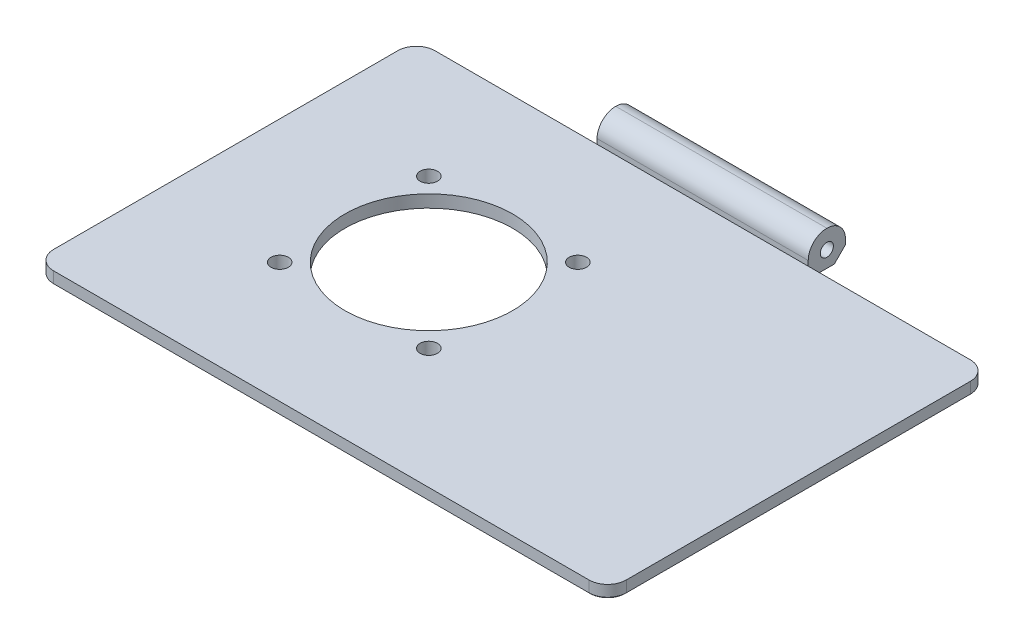
ISO-10303-21;
HEADER;
FILE_DESCRIPTION(('STEP AP214'),'2;1');
FILE_NAME('part.step','',(''),(''),'','','');
FILE_SCHEMA(('AUTOMOTIVE_DESIGN { 1 0 10303 214 1 1 1 1 }'));
ENDSEC;
DATA;
#1=APPLICATION_CONTEXT('core data for automotive mechanical design processes');
#2=APPLICATION_PROTOCOL_DEFINITION('international standard','automotive_design',2000,#1);
#3=PRODUCT_CONTEXT('',#1,'mechanical');
#4=PRODUCT('Part','Part','',(#3));
#5=PRODUCT_RELATED_PRODUCT_CATEGORY('part','',(#4));
#6=PRODUCT_DEFINITION_FORMATION('','',#4);
#7=PRODUCT_DEFINITION_CONTEXT('part definition',#1,'design');
#8=PRODUCT_DEFINITION('design','',#6,#7);
#9=PRODUCT_DEFINITION_SHAPE('','',#8);
#10=(LENGTH_UNIT() NAMED_UNIT(*) SI_UNIT(.MILLI.,.METRE.));
#11=(NAMED_UNIT(*) PLANE_ANGLE_UNIT() SI_UNIT($,.RADIAN.));
#12=(NAMED_UNIT(*) SI_UNIT($,.STERADIAN.) SOLID_ANGLE_UNIT());
#13=UNCERTAINTY_MEASURE_WITH_UNIT(LENGTH_MEASURE(1.E-05),#10,'distance_accuracy_value','');
#14=(GEOMETRIC_REPRESENTATION_CONTEXT(3) GLOBAL_UNCERTAINTY_ASSIGNED_CONTEXT((#13)) GLOBAL_UNIT_ASSIGNED_CONTEXT((#10,
#11,#12)) REPRESENTATION_CONTEXT('',''));
#15=CARTESIAN_POINT('',(0.,0.,0.));
#16=DIRECTION('',(0.,0.,1.));
#17=DIRECTION('',(1.,0.,0.));
#18=AXIS2_PLACEMENT_3D('',#15,#16,#17);
#19=CARTESIAN_POINT('',(3.00000000000002,2.,-61.4));
#20=DIRECTION('',(0.,0.,1.));
#21=DIRECTION('',(1.,0.,0.));
#22=AXIS2_PLACEMENT_3D('',#19,#20,#21);
#23=PLANE('',#22);
#24=DIRECTION('',(0.,-1.,0.));
#25=VECTOR('',#24,1.);
#26=CARTESIAN_POINT('',(29.1,5.8,-61.4));
#27=LINE('',#26,#25);
#28=CARTESIAN_POINT('',(29.1,2.,-61.4));
#29=VERTEX_POINT('',#28);
#30=CARTESIAN_POINT('',(29.1,0.200000000000006,-61.4));
#31=VERTEX_POINT('',#30);
#32=EDGE_CURVE('E358',#29,#31,#27,.T.);
#33=ORIENTED_EDGE('',*,*,#32,.T.);
#34=DIRECTION('',(-1.,0.,0.));
#35=VECTOR('',#34,1.);
#36=CARTESIAN_POINT('',(3.00000000000002,0.200000000000006,-61.4));
#37=LINE('',#36,#35);
#38=CARTESIAN_POINT('',(3.00000000000002,0.200000000000006,-61.4));
#39=VERTEX_POINT('',#38);
#40=EDGE_CURVE('E275',#31,#39,#37,.T.);
#41=ORIENTED_EDGE('',*,*,#40,.T.);
#42=DIRECTION('',(0.,-1.,0.));
#43=VECTOR('',#42,1.);
#44=CARTESIAN_POINT('',(3.00000000000002,2.,-61.4));
#45=LINE('',#44,#43);
#46=CARTESIAN_POINT('',(3.00000000000002,2.,-61.4));
#47=VERTEX_POINT('',#46);
#48=EDGE_CURVE('E210',#47,#39,#45,.T.);
#49=ORIENTED_EDGE('',*,*,#48,.F.);
#50=DIRECTION('',(-1.,0.,0.));
#51=VECTOR('',#50,1.);
#52=CARTESIAN_POINT('',(3.00000000000002,2.,-61.4));
#53=LINE('',#52,#51);
#54=EDGE_CURVE('E197',#29,#47,#53,.T.);
#55=ORIENTED_EDGE('',*,*,#54,.F.);
#56=EDGE_LOOP('',(#33,#41,#49,#55));
#57=FACE_BOUND('',#56,.T.);
#58=ADVANCED_FACE('F37',(#57),#23,.F.);
#59=CARTESIAN_POINT('',(89.2,2.,-58.4));
#60=DIRECTION('',(0.,-1.,0.));
#61=DIRECTION('',(0.,0.,-1.));
#62=AXIS2_PLACEMENT_3D('',#59,#60,#61);
#63=CYLINDRICAL_SURFACE('',#62,3.);
#64=DIRECTION('',(0.,-1.,0.));
#65=VECTOR('',#64,1.);
#66=CARTESIAN_POINT('',(92.2,2.,-58.4));
#67=LINE('',#66,#65);
#68=CARTESIAN_POINT('',(92.2,2.,-58.4));
#69=VERTEX_POINT('',#68);
#70=CARTESIAN_POINT('',(92.2,0.200000000000006,-58.4));
#71=VERTEX_POINT('',#70);
#72=EDGE_CURVE('E377',#69,#71,#67,.T.);
#73=ORIENTED_EDGE('',*,*,#72,.T.);
#74=CARTESIAN_POINT('',(89.2,0.200000000000006,-58.4));
#75=DIRECTION('',(0.,-1.,0.));
#76=DIRECTION('',(0.,0.,-1.));
#77=AXIS2_PLACEMENT_3D('',#74,#75,#76);
#78=CIRCLE('',#77,3.);
#79=CARTESIAN_POINT('',(89.2,0.200000000000006,-61.4));
#80=VERTEX_POINT('',#79);
#81=EDGE_CURVE('E47',#71,#80,#78,.F.);
#82=ORIENTED_EDGE('',*,*,#81,.T.);
#83=DIRECTION('',(0.,-1.,0.));
#84=VECTOR('',#83,1.);
#85=CARTESIAN_POINT('',(89.2,2.,-61.4));
#86=LINE('',#85,#84);
#87=CARTESIAN_POINT('',(89.2,2.,-61.4));
#88=VERTEX_POINT('',#87);
#89=EDGE_CURVE('E189',#88,#80,#86,.T.);
#90=ORIENTED_EDGE('',*,*,#89,.F.);
#91=CARTESIAN_POINT('',(89.2,2.,-58.4));
#92=DIRECTION('',(0.,1.,0.));
#93=DIRECTION('',(0.,0.,-1.));
#94=AXIS2_PLACEMENT_3D('',#91,#92,#93);
#95=CIRCLE('',#94,3.);
#96=EDGE_CURVE('E200',#69,#88,#95,.T.);
#97=ORIENTED_EDGE('',*,*,#96,.F.);
#98=EDGE_LOOP('',(#73,#82,#90,#97));
#99=FACE_BOUND('',#98,.T.);
#100=ADVANCED_FACE('F207',(#99),#63,.T.);
#101=ORIENTED_EDGE('',*,*,#89,.T.);
#102=DIRECTION('',(-1.,0.,0.));
#103=VECTOR('',#102,1.);
#104=CARTESIAN_POINT('',(63.1,0.200000000000006,-61.4));
#105=LINE('',#104,#103);
#106=CARTESIAN_POINT('',(63.1,0.200000000000006,-61.4));
#107=VERTEX_POINT('',#106);
#108=EDGE_CURVE('E285',#80,#107,#105,.T.);
#109=ORIENTED_EDGE('',*,*,#108,.T.);
#110=DIRECTION('',(0.,-1.,0.));
#111=VECTOR('',#110,1.);
#112=CARTESIAN_POINT('',(63.1,5.8,-61.4));
#113=LINE('',#112,#111);
#114=CARTESIAN_POINT('',(63.1,2.,-61.4));
#115=VERTEX_POINT('',#114);
#116=EDGE_CURVE('E192',#115,#107,#113,.T.);
#117=ORIENTED_EDGE('',*,*,#116,.F.);
#118=EDGE_CURVE('E185',#88,#115,#53,.T.);
#119=ORIENTED_EDGE('',*,*,#118,.F.);
#120=EDGE_LOOP('',(#101,#109,#117,#119));
#121=FACE_BOUND('',#120,.T.);
#122=ADVANCED_FACE('F187',(#121),#23,.F.);
#123=CARTESIAN_POINT('',(3.,2.,-58.4));
#124=DIRECTION('',(0.,-1.,0.));
#125=DIRECTION('',(0.,0.,-1.));
#126=AXIS2_PLACEMENT_3D('',#123,#124,#125);
#127=CYLINDRICAL_SURFACE('',#126,3.);
#128=ORIENTED_EDGE('',*,*,#48,.T.);
#129=CARTESIAN_POINT('',(3.,0.200000000000006,-58.4));
#130=DIRECTION('',(0.,-1.,0.));
#131=DIRECTION('',(0.,0.,-1.));
#132=AXIS2_PLACEMENT_3D('',#129,#130,#131);
#133=CIRCLE('',#132,3.);
#134=CARTESIAN_POINT('',(0.,0.200000000000006,-58.4));
#135=VERTEX_POINT('',#134);
#136=EDGE_CURVE('E277',#39,#135,#133,.F.);
#137=ORIENTED_EDGE('',*,*,#136,.T.);
#138=DIRECTION('',(0.,-1.,0.));
#139=VECTOR('',#138,1.);
#140=CARTESIAN_POINT('',(0.,2.,-58.4));
#141=LINE('',#140,#139);
#142=CARTESIAN_POINT('',(0.,2.,-58.4));
#143=VERTEX_POINT('',#142);
#144=EDGE_CURVE('E216',#143,#135,#141,.T.);
#145=ORIENTED_EDGE('',*,*,#144,.F.);
#146=CARTESIAN_POINT('',(3.,2.,-58.4));
#147=DIRECTION('',(0.,1.,0.));
#148=DIRECTION('',(0.,0.,-1.));
#149=AXIS2_PLACEMENT_3D('',#146,#147,#148);
#150=CIRCLE('',#149,3.);
#151=EDGE_CURVE('E196',#47,#143,#150,.T.);
#152=ORIENTED_EDGE('',*,*,#151,.F.);
#153=EDGE_LOOP('',(#128,#137,#145,#152));
#154=FACE_BOUND('',#153,.T.);
#155=ADVANCED_FACE('F501',(#154),#127,.T.);
#156=CARTESIAN_POINT('',(0.,2.,-3.00000000000002));
#157=DIRECTION('',(1.,0.,0.));
#158=DIRECTION('',(0.,0.,-1.));
#159=AXIS2_PLACEMENT_3D('',#156,#157,#158);
#160=PLANE('',#159);
#161=ORIENTED_EDGE('',*,*,#144,.T.);
#162=DIRECTION('',(0.,0.,1.));
#163=VECTOR('',#162,1.);
#164=CARTESIAN_POINT('',(0.,0.200000000000006,-3.00000000000002));
#165=LINE('',#164,#163);
#166=CARTESIAN_POINT('',(0.,0.200000000000006,-3.00000000000002));
#167=VERTEX_POINT('',#166);
#168=EDGE_CURVE('E279',#135,#167,#165,.T.);
#169=ORIENTED_EDGE('',*,*,#168,.T.);
#170=DIRECTION('',(0.,-1.,0.));
#171=VECTOR('',#170,1.);
#172=CARTESIAN_POINT('',(0.,2.,-3.00000000000002));
#173=LINE('',#172,#171);
#174=CARTESIAN_POINT('',(0.,2.,-3.00000000000002));
#175=VERTEX_POINT('',#174);
#176=EDGE_CURVE('E386',#175,#167,#173,.T.);
#177=ORIENTED_EDGE('',*,*,#176,.F.);
#178=DIRECTION('',(0.,0.,1.));
#179=VECTOR('',#178,1.);
#180=CARTESIAN_POINT('',(0.,2.,-3.00000000000002));
#181=LINE('',#180,#179);
#182=EDGE_CURVE('E368',#143,#175,#181,.T.);
#183=ORIENTED_EDGE('',*,*,#182,.F.);
#184=EDGE_LOOP('',(#161,#169,#177,#183));
#185=FACE_BOUND('',#184,.T.);
#186=ADVANCED_FACE('F393',(#185),#160,.F.);
#187=CARTESIAN_POINT('',(3.,2.,-3.));
#188=DIRECTION('',(0.,-1.,0.));
#189=DIRECTION('',(0.,0.,-1.));
#190=AXIS2_PLACEMENT_3D('',#187,#188,#189);
#191=CYLINDRICAL_SURFACE('',#190,3.);
#192=ORIENTED_EDGE('',*,*,#176,.T.);
#193=CARTESIAN_POINT('',(3.,0.200000000000006,-3.));
#194=DIRECTION('',(0.,-1.,0.));
#195=DIRECTION('',(0.,0.,-1.));
#196=AXIS2_PLACEMENT_3D('',#193,#194,#195);
#197=CIRCLE('',#196,3.);
#198=CARTESIAN_POINT('',(3.00000000000002,0.200000000000006,0.));
#199=VERTEX_POINT('',#198);
#200=EDGE_CURVE('E281',#167,#199,#197,.F.);
#201=ORIENTED_EDGE('',*,*,#200,.T.);
#202=DIRECTION('',(0.,-1.,0.));
#203=VECTOR('',#202,1.);
#204=CARTESIAN_POINT('',(3.00000000000002,2.,0.));
#205=LINE('',#204,#203);
#206=CARTESIAN_POINT('',(3.00000000000002,2.,0.));
#207=VERTEX_POINT('',#206);
#208=EDGE_CURVE('E383',#207,#199,#205,.T.);
#209=ORIENTED_EDGE('',*,*,#208,.F.);
#210=CARTESIAN_POINT('',(3.,2.,-3.));
#211=DIRECTION('',(0.,1.,0.));
#212=DIRECTION('',(0.,0.,-1.));
#213=AXIS2_PLACEMENT_3D('',#210,#211,#212);
#214=CIRCLE('',#213,3.);
#215=EDGE_CURVE('E370',#175,#207,#214,.T.);
#216=ORIENTED_EDGE('',*,*,#215,.F.);
#217=EDGE_LOOP('',(#192,#201,#209,#216));
#218=FACE_BOUND('',#217,.T.);
#219=ADVANCED_FACE('F419',(#218),#191,.T.);
#220=CARTESIAN_POINT('',(3.00000000000002,2.,0.));
#221=DIRECTION('',(0.,0.,-1.));
#222=DIRECTION('',(-1.,0.,0.));
#223=AXIS2_PLACEMENT_3D('',#220,#221,#222);
#224=PLANE('',#223);
#225=ORIENTED_EDGE('',*,*,#208,.T.);
#226=DIRECTION('',(1.,0.,0.));
#227=VECTOR('',#226,1.);
#228=CARTESIAN_POINT('',(89.2,0.200000000000006,0.));
#229=LINE('',#228,#227);
#230=CARTESIAN_POINT('',(89.2,0.200000000000006,0.));
#231=VERTEX_POINT('',#230);
#232=EDGE_CURVE('E283',#199,#231,#229,.T.);
#233=ORIENTED_EDGE('',*,*,#232,.T.);
#234=DIRECTION('',(0.,-1.,0.));
#235=VECTOR('',#234,1.);
#236=CARTESIAN_POINT('',(89.2,2.,0.));
#237=LINE('',#236,#235);
#238=CARTESIAN_POINT('',(89.2,2.,0.));
#239=VERTEX_POINT('',#238);
#240=EDGE_CURVE('E381',#239,#231,#237,.T.);
#241=ORIENTED_EDGE('',*,*,#240,.F.);
#242=DIRECTION('',(1.,0.,0.));
#243=VECTOR('',#242,1.);
#244=CARTESIAN_POINT('',(3.00000000000002,2.,0.));
#245=LINE('',#244,#243);
#246=EDGE_CURVE('E372',#207,#239,#245,.T.);
#247=ORIENTED_EDGE('',*,*,#246,.F.);
#248=EDGE_LOOP('',(#225,#233,#241,#247));
#249=FACE_BOUND('',#248,.T.);
#250=ADVANCED_FACE('F424',(#249),#224,.F.);
#251=CARTESIAN_POINT('',(89.2,2.,-3.));
#252=DIRECTION('',(0.,-1.,0.));
#253=DIRECTION('',(0.,0.,-1.));
#254=AXIS2_PLACEMENT_3D('',#251,#252,#253);
#255=CYLINDRICAL_SURFACE('',#254,3.);
#256=ORIENTED_EDGE('',*,*,#240,.T.);
#257=CARTESIAN_POINT('',(89.2,0.200000000000006,-3.));
#258=DIRECTION('',(0.,-1.,0.));
#259=DIRECTION('',(0.,0.,-1.));
#260=AXIS2_PLACEMENT_3D('',#257,#258,#259);
#261=CIRCLE('',#260,3.);
#262=CARTESIAN_POINT('',(92.2,0.200000000000006,-3.00000000000002));
#263=VERTEX_POINT('',#262);
#264=EDGE_CURVE('E61',#231,#263,#261,.F.);
#265=ORIENTED_EDGE('',*,*,#264,.T.);
#266=DIRECTION('',(0.,-1.,0.));
#267=VECTOR('',#266,1.);
#268=CARTESIAN_POINT('',(92.2,2.,-3.00000000000002));
#269=LINE('',#268,#267);
#270=CARTESIAN_POINT('',(92.2,2.,-3.00000000000002));
#271=VERTEX_POINT('',#270);
#272=EDGE_CURVE('E379',#271,#263,#269,.T.);
#273=ORIENTED_EDGE('',*,*,#272,.F.);
#274=CARTESIAN_POINT('',(89.2,2.,-3.));
#275=DIRECTION('',(0.,1.,0.));
#276=DIRECTION('',(0.,0.,1.));
#277=AXIS2_PLACEMENT_3D('',#274,#275,#276);
#278=CIRCLE('',#277,3.);
#279=EDGE_CURVE('E374',#239,#271,#278,.T.);
#280=ORIENTED_EDGE('',*,*,#279,.F.);
#281=EDGE_LOOP('',(#256,#265,#273,#280));
#282=FACE_BOUND('',#281,.T.);
#283=ADVANCED_FACE('F514',(#282),#255,.T.);
#284=CARTESIAN_POINT('',(92.2,2.,-3.00000000000002));
#285=DIRECTION('',(-1.,0.,0.));
#286=DIRECTION('',(0.,0.,1.));
#287=AXIS2_PLACEMENT_3D('',#284,#285,#286);
#288=PLANE('',#287);
#289=ORIENTED_EDGE('',*,*,#272,.T.);
#290=DIRECTION('',(0.,0.,-1.));
#291=VECTOR('',#290,1.);
#292=CARTESIAN_POINT('',(92.2,0.200000000000006,-58.4));
#293=LINE('',#292,#291);
#294=EDGE_CURVE('E11',#263,#71,#293,.T.);
#295=ORIENTED_EDGE('',*,*,#294,.T.);
#296=ORIENTED_EDGE('',*,*,#72,.F.);
#297=DIRECTION('',(0.,0.,-1.));
#298=VECTOR('',#297,1.);
#299=CARTESIAN_POINT('',(92.2,2.,-3.00000000000002));
#300=LINE('',#299,#298);
#301=EDGE_CURVE('E203',#271,#69,#300,.T.);
#302=ORIENTED_EDGE('',*,*,#301,.F.);
#303=EDGE_LOOP('',(#289,#295,#296,#302));
#304=FACE_BOUND('',#303,.T.);
#305=ADVANCED_FACE('F517',(#304),#288,.F.);
#306=CARTESIAN_POINT('',(89.2,2.,-58.4));
#307=DIRECTION('',(0.,-1.,0.));
#308=DIRECTION('',(0.,0.,-1.));
#309=AXIS2_PLACEMENT_3D('',#306,#307,#308);
#310=PLANE('',#309);
#311=CARTESIAN_POINT('',(44.,2.,-43.4000000000003));
#312=DIRECTION('',(0.,1.,0.));
#313=DIRECTION('',(0.,0.,1.));
#314=AXIS2_PLACEMENT_3D('',#311,#312,#313);
#315=CIRCLE('',#314,1.4);
#316=CARTESIAN_POINT('',(44.,2.,-42.0000000000003));
#317=VERTEX_POINT('',#316);
#318=EDGE_CURVE('E336',#317,#317,#315,.T.);
#319=ORIENTED_EDGE('',*,*,#318,.F.);
#320=EDGE_LOOP('',(#319));
#321=FACE_BOUND('',#320,.T.);
#322=CARTESIAN_POINT('',(32.,2.,-31.4000000000002));
#323=DIRECTION('',(0.,1.,0.));
#324=DIRECTION('',(0.,0.,1.));
#325=AXIS2_PLACEMENT_3D('',#322,#323,#324);
#326=CIRCLE('',#325,13.5);
#327=CARTESIAN_POINT('',(32.,2.,-17.9000000000002));
#328=VERTEX_POINT('',#327);
#329=EDGE_CURVE('E335',#328,#328,#326,.T.);
#330=ORIENTED_EDGE('',*,*,#329,.F.);
#331=EDGE_LOOP('',(#330));
#332=FACE_BOUND('',#331,.T.);
#333=CARTESIAN_POINT('',(44.0000000000002,2.,-19.4000000000003));
#334=DIRECTION('',(0.,1.,0.));
#335=DIRECTION('',(0.,0.,1.));
#336=AXIS2_PLACEMENT_3D('',#333,#334,#335);
#337=CIRCLE('',#336,1.4);
#338=CARTESIAN_POINT('',(44.0000000000002,2.,-18.0000000000003));
#339=VERTEX_POINT('',#338);
#340=EDGE_CURVE('E328',#339,#339,#337,.T.);
#341=ORIENTED_EDGE('',*,*,#340,.F.);
#342=EDGE_LOOP('',(#341));
#343=FACE_BOUND('',#342,.T.);
#344=CARTESIAN_POINT('',(20.0000000000002,2.,-19.4));
#345=DIRECTION('',(0.,1.,0.));
#346=DIRECTION('',(0.,0.,1.));
#347=AXIS2_PLACEMENT_3D('',#344,#345,#346);
#348=CIRCLE('',#347,1.4);
#349=CARTESIAN_POINT('',(20.0000000000002,2.,-18.));
#350=VERTEX_POINT('',#349);
#351=EDGE_CURVE('E318',#350,#350,#348,.T.);
#352=ORIENTED_EDGE('',*,*,#351,.F.);
#353=EDGE_LOOP('',(#352));
#354=FACE_BOUND('',#353,.T.);
#355=CARTESIAN_POINT('',(20.,2.,-43.4));
#356=DIRECTION('',(0.,1.,0.));
#357=DIRECTION('',(0.,0.,1.));
#358=AXIS2_PLACEMENT_3D('',#355,#356,#357);
#359=CIRCLE('',#358,1.4);
#360=CARTESIAN_POINT('',(20.,2.,-42.));
#361=VERTEX_POINT('',#360);
#362=EDGE_CURVE('E343',#361,#361,#359,.T.);
#363=ORIENTED_EDGE('',*,*,#362,.F.);
#364=EDGE_LOOP('',(#363));
#365=FACE_BOUND('',#364,.T.);
#366=ORIENTED_EDGE('',*,*,#96,.T.);
#367=ORIENTED_EDGE('',*,*,#118,.T.);
#368=DIRECTION('',(-1.,0.,0.));
#369=VECTOR('',#368,1.);
#370=CARTESIAN_POINT('',(89.2,2.,-61.4));
#371=LINE('',#370,#369);
#372=EDGE_CURVE('E205',#115,#29,#371,.T.);
#373=ORIENTED_EDGE('',*,*,#372,.T.);
#374=ORIENTED_EDGE('',*,*,#54,.T.);
#375=ORIENTED_EDGE('',*,*,#151,.T.);
#376=ORIENTED_EDGE('',*,*,#182,.T.);
#377=ORIENTED_EDGE('',*,*,#215,.T.);
#378=ORIENTED_EDGE('',*,*,#246,.T.);
#379=ORIENTED_EDGE('',*,*,#279,.T.);
#380=ORIENTED_EDGE('',*,*,#301,.T.);
#381=EDGE_LOOP('',(#366,#367,#373,#374,#375,#376,#377,#378,#379,#380));
#382=FACE_BOUND('',#381,.T.);
#383=ADVANCED_FACE('F201',(#321,#332,#343,#354,#365,#382),#310,.F.);
#384=CARTESIAN_POINT('',(89.2,0.,-58.4));
#385=DIRECTION('',(0.,-1.,0.));
#386=DIRECTION('',(0.,0.,-1.));
#387=AXIS2_PLACEMENT_3D('',#384,#385,#386);
#388=PLANE('',#387);
#389=CARTESIAN_POINT('',(44.,0.,-43.4000000000003));
#390=DIRECTION('',(0.,1.,0.));
#391=DIRECTION('',(0.,0.,1.));
#392=AXIS2_PLACEMENT_3D('',#389,#390,#391);
#393=CIRCLE('',#392,1.4);
#394=CARTESIAN_POINT('',(44.,0.,-42.0000000000003));
#395=VERTEX_POINT('',#394);
#396=EDGE_CURVE('E332',#395,#395,#393,.T.);
#397=ORIENTED_EDGE('',*,*,#396,.T.);
#398=EDGE_LOOP('',(#397));
#399=FACE_BOUND('',#398,.T.);
#400=CARTESIAN_POINT('',(32.,0.,-31.4000000000002));
#401=DIRECTION('',(0.,1.,0.));
#402=DIRECTION('',(0.,0.,1.));
#403=AXIS2_PLACEMENT_3D('',#400,#401,#402);
#404=CIRCLE('',#403,13.5);
#405=CARTESIAN_POINT('',(32.,0.,-17.9000000000002));
#406=VERTEX_POINT('',#405);
#407=EDGE_CURVE('E340',#406,#406,#404,.T.);
#408=ORIENTED_EDGE('',*,*,#407,.T.);
#409=EDGE_LOOP('',(#408));
#410=FACE_BOUND('',#409,.T.);
#411=CARTESIAN_POINT('',(44.0000000000002,0.,-19.4000000000003));
#412=DIRECTION('',(0.,1.,0.));
#413=DIRECTION('',(0.,0.,1.));
#414=AXIS2_PLACEMENT_3D('',#411,#412,#413);
#415=CIRCLE('',#414,1.4);
#416=CARTESIAN_POINT('',(44.0000000000002,0.,-18.0000000000003));
#417=VERTEX_POINT('',#416);
#418=EDGE_CURVE('E339',#417,#417,#415,.T.);
#419=ORIENTED_EDGE('',*,*,#418,.T.);
#420=EDGE_LOOP('',(#419));
#421=FACE_BOUND('',#420,.T.);
#422=CARTESIAN_POINT('',(20.0000000000002,0.,-19.4));
#423=DIRECTION('',(0.,1.,0.));
#424=DIRECTION('',(0.,0.,1.));
#425=AXIS2_PLACEMENT_3D('',#422,#423,#424);
#426=CIRCLE('',#425,1.4);
#427=CARTESIAN_POINT('',(20.0000000000002,0.,-18.));
#428=VERTEX_POINT('',#427);
#429=EDGE_CURVE('E323',#428,#428,#426,.T.);
#430=ORIENTED_EDGE('',*,*,#429,.T.);
#431=EDGE_LOOP('',(#430));
#432=FACE_BOUND('',#431,.T.);
#433=CARTESIAN_POINT('',(20.,0.,-43.4));
#434=DIRECTION('',(0.,1.,0.));
#435=DIRECTION('',(0.,0.,1.));
#436=AXIS2_PLACEMENT_3D('',#433,#434,#435);
#437=CIRCLE('',#436,1.4);
#438=CARTESIAN_POINT('',(20.,0.,-42.));
#439=VERTEX_POINT('',#438);
#440=EDGE_CURVE('E234',#439,#439,#437,.T.);
#441=ORIENTED_EDGE('',*,*,#440,.T.);
#442=EDGE_LOOP('',(#441));
#443=FACE_BOUND('',#442,.T.);
#444=DIRECTION('',(1.,0.,0.));
#445=VECTOR('',#444,1.);
#446=CARTESIAN_POINT('',(29.1,0.,-61.2));
#447=LINE('',#446,#445);
#448=CARTESIAN_POINT('',(3.00000000000002,0.,-61.2));
#449=VERTEX_POINT('',#448);
#450=CARTESIAN_POINT('',(29.3,0.,-61.2));
#451=VERTEX_POINT('',#450);
#452=EDGE_CURVE('E260',#449,#451,#447,.T.);
#453=ORIENTED_EDGE('',*,*,#452,.T.);
#454=DIRECTION('',(0.,0.,-1.));
#455=VECTOR('',#454,1.);
#456=CARTESIAN_POINT('',(29.3,0.,-58.4));
#457=LINE('',#456,#455);
#458=CARTESIAN_POINT('',(29.3,0.,-65.4));
#459=VERTEX_POINT('',#458);
#460=EDGE_CURVE('E264',#451,#459,#457,.T.);
#461=ORIENTED_EDGE('',*,*,#460,.T.);
#462=DIRECTION('',(1.,0.,0.));
#463=VECTOR('',#462,1.);
#464=CARTESIAN_POINT('',(89.2,0.,-65.4));
#465=LINE('',#464,#463);
#466=CARTESIAN_POINT('',(62.9,0.,-65.4));
#467=VERTEX_POINT('',#466);
#468=EDGE_CURVE('E229',#459,#467,#465,.T.);
#469=ORIENTED_EDGE('',*,*,#468,.T.);
#470=DIRECTION('',(0.,0.,1.));
#471=VECTOR('',#470,1.);
#472=CARTESIAN_POINT('',(62.9,0.,-58.4));
#473=LINE('',#472,#471);
#474=CARTESIAN_POINT('',(62.9,0.,-61.2));
#475=VERTEX_POINT('',#474);
#476=EDGE_CURVE('E262',#467,#475,#473,.T.);
#477=ORIENTED_EDGE('',*,*,#476,.T.);
#478=DIRECTION('',(1.,0.,0.));
#479=VECTOR('',#478,1.);
#480=CARTESIAN_POINT('',(89.2,0.,-61.2));
#481=LINE('',#480,#479);
#482=CARTESIAN_POINT('',(89.2,0.,-61.2));
#483=VERTEX_POINT('',#482);
#484=EDGE_CURVE('E250',#475,#483,#481,.T.);
#485=ORIENTED_EDGE('',*,*,#484,.T.);
#486=CARTESIAN_POINT('',(89.2,0.,-58.4));
#487=DIRECTION('',(0.,-1.,0.));
#488=DIRECTION('',(0.,0.,-1.));
#489=AXIS2_PLACEMENT_3D('',#486,#487,#488);
#490=CIRCLE('',#489,2.8);
#491=CARTESIAN_POINT('',(92.,0.,-58.4));
#492=VERTEX_POINT('',#491);
#493=EDGE_CURVE('E246',#483,#492,#490,.T.);
#494=ORIENTED_EDGE('',*,*,#493,.T.);
#495=DIRECTION('',(0.,0.,1.));
#496=VECTOR('',#495,1.);
#497=CARTESIAN_POINT('',(92.,0.,-3.00000000000002));
#498=LINE('',#497,#496);
#499=CARTESIAN_POINT('',(92.,0.,-3.00000000000002));
#500=VERTEX_POINT('',#499);
#501=EDGE_CURVE('E244',#492,#500,#498,.T.);
#502=ORIENTED_EDGE('',*,*,#501,.T.);
#503=CARTESIAN_POINT('',(89.2,0.,-3.));
#504=DIRECTION('',(0.,-1.,0.));
#505=DIRECTION('',(0.,0.,-1.));
#506=AXIS2_PLACEMENT_3D('',#503,#504,#505);
#507=CIRCLE('',#506,2.8);
#508=CARTESIAN_POINT('',(89.2,0.,-0.200000000000003));
#509=VERTEX_POINT('',#508);
#510=EDGE_CURVE('E248',#500,#509,#507,.T.);
#511=ORIENTED_EDGE('',*,*,#510,.T.);
#512=DIRECTION('',(-1.,0.,0.));
#513=VECTOR('',#512,1.);
#514=CARTESIAN_POINT('',(3.00000000000002,0.,-0.200000000000006));
#515=LINE('',#514,#513);
#516=CARTESIAN_POINT('',(3.00000000000002,0.,-0.200000000000006));
#517=VERTEX_POINT('',#516);
#518=EDGE_CURVE('E252',#509,#517,#515,.T.);
#519=ORIENTED_EDGE('',*,*,#518,.T.);
#520=CARTESIAN_POINT('',(3.,0.,-3.));
#521=DIRECTION('',(0.,-1.,0.));
#522=DIRECTION('',(0.,0.,-1.));
#523=AXIS2_PLACEMENT_3D('',#520,#521,#522);
#524=CIRCLE('',#523,2.79999999999999);
#525=CARTESIAN_POINT('',(0.200000000000006,0.,-3.00000000000002));
#526=VERTEX_POINT('',#525);
#527=EDGE_CURVE('E254',#517,#526,#524,.T.);
#528=ORIENTED_EDGE('',*,*,#527,.T.);
#529=DIRECTION('',(0.,0.,-1.));
#530=VECTOR('',#529,1.);
#531=CARTESIAN_POINT('',(0.200000000000006,0.,-58.4));
#532=LINE('',#531,#530);
#533=CARTESIAN_POINT('',(0.200000000000006,0.,-58.4));
#534=VERTEX_POINT('',#533);
#535=EDGE_CURVE('E256',#526,#534,#532,.T.);
#536=ORIENTED_EDGE('',*,*,#535,.T.);
#537=CARTESIAN_POINT('',(3.,0.,-58.4));
#538=DIRECTION('',(0.,-1.,0.));
#539=DIRECTION('',(0.,0.,-1.));
#540=AXIS2_PLACEMENT_3D('',#537,#538,#539);
#541=CIRCLE('',#540,2.8);
#542=EDGE_CURVE('E258',#534,#449,#541,.T.);
#543=ORIENTED_EDGE('',*,*,#542,.T.);
#544=EDGE_LOOP('',(#453,#461,#469,#477,#485,#494,#502,#511,#519,#528,#536,#543));
#545=FACE_BOUND('',#544,.T.);
#546=ADVANCED_FACE('F409',(#399,#410,#421,#432,#443,#545),#388,.T.);
#547=CARTESIAN_POINT('',(29.1,5.8,-61.4));
#548=DIRECTION('',(0.,0.,1.));
#549=DIRECTION('',(1.,0.,0.));
#550=AXIS2_PLACEMENT_3D('',#547,#548,#549);
#551=PLANE('',#550);
#552=CARTESIAN_POINT('',(63.1,2.8,-61.4));
#553=VERTEX_POINT('',#552);
#554=EDGE_CURVE('E359',#553,#115,#113,.T.);
#555=ORIENTED_EDGE('',*,*,#554,.F.);
#556=DIRECTION('',(-1.,0.,0.));
#557=VECTOR('',#556,1.);
#558=CARTESIAN_POINT('',(29.1,2.8,-61.4));
#559=LINE('',#558,#557);
#560=CARTESIAN_POINT('',(29.1,2.8,-61.4));
#561=VERTEX_POINT('',#560);
#562=EDGE_CURVE('E227',#553,#561,#559,.T.);
#563=ORIENTED_EDGE('',*,*,#562,.T.);
#564=EDGE_CURVE('E356',#561,#29,#27,.T.);
#565=ORIENTED_EDGE('',*,*,#564,.T.);
#566=ORIENTED_EDGE('',*,*,#372,.F.);
#567=EDGE_LOOP('',(#555,#563,#565,#566));
#568=FACE_BOUND('',#567,.T.);
#569=ADVANCED_FACE('F476',(#568),#551,.T.);
#570=CARTESIAN_POINT('',(29.1,5.8,-67.4));
#571=DIRECTION('',(-1.,0.,0.));
#572=DIRECTION('',(0.,0.,1.));
#573=AXIS2_PLACEMENT_3D('',#570,#571,#572);
#574=PLANE('',#573);
#575=CARTESIAN_POINT('',(29.1,2.8,-64.4));
#576=DIRECTION('',(-1.,0.,0.));
#577=DIRECTION('',(0.,0.,1.));
#578=AXIS2_PLACEMENT_3D('',#575,#576,#577);
#579=CIRCLE('',#578,1.04999999999999);
#580=CARTESIAN_POINT('',(29.1,2.8,-63.35));
#581=VERTEX_POINT('',#580);
#582=EDGE_CURVE('E352',#581,#581,#579,.T.);
#583=ORIENTED_EDGE('',*,*,#582,.F.);
#584=EDGE_LOOP('',(#583));
#585=FACE_BOUND('',#584,.T.);
#586=DIRECTION('',(0.,0.707106781186552,-0.707106781186543));
#587=VECTOR('',#586,1.);
#588=CARTESIAN_POINT('',(29.1,3.90000000000004,-69.3));
#589=LINE('',#588,#587);
#590=CARTESIAN_POINT('',(29.1,2.00000000000003,-67.4));
#591=VERTEX_POINT('',#590);
#592=CARTESIAN_POINT('',(29.1,0.200000000000007,-65.6));
#593=VERTEX_POINT('',#592);
#594=EDGE_CURVE('E241',#591,#593,#589,.F.);
#595=ORIENTED_EDGE('',*,*,#594,.T.);
#596=DIRECTION('',(0.,0.,1.));
#597=VECTOR('',#596,1.);
#598=CARTESIAN_POINT('',(29.1,0.200000000000006,-67.4));
#599=LINE('',#598,#597);
#600=EDGE_CURVE('E271',#593,#31,#599,.T.);
#601=ORIENTED_EDGE('',*,*,#600,.T.);
#602=ORIENTED_EDGE('',*,*,#32,.F.);
#603=ORIENTED_EDGE('',*,*,#564,.F.);
#604=CARTESIAN_POINT('',(29.1,2.8,-64.4));
#605=DIRECTION('',(-1.,0.,0.));
#606=DIRECTION('',(0.,0.,1.));
#607=AXIS2_PLACEMENT_3D('',#604,#605,#606);
#608=CIRCLE('',#607,3.);
#609=CARTESIAN_POINT('',(29.1,5.8,-64.4));
#610=VERTEX_POINT('',#609);
#611=EDGE_CURVE('E223',#561,#610,#608,.T.);
#612=ORIENTED_EDGE('',*,*,#611,.T.);
#613=CARTESIAN_POINT('',(29.1,2.8,-64.4));
#614=DIRECTION('',(-1.,0.,0.));
#615=DIRECTION('',(0.,0.,1.));
#616=AXIS2_PLACEMENT_3D('',#613,#614,#615);
#617=CIRCLE('',#616,3.);
#618=CARTESIAN_POINT('',(29.1,2.8,-67.4));
#619=VERTEX_POINT('',#618);
#620=EDGE_CURVE('E225',#610,#619,#617,.T.);
#621=ORIENTED_EDGE('',*,*,#620,.T.);
#622=DIRECTION('',(0.,-1.,0.));
#623=VECTOR('',#622,1.);
#624=CARTESIAN_POINT('',(29.1,5.8,-67.4));
#625=LINE('',#624,#623);
#626=EDGE_CURVE('E355',#619,#591,#625,.T.);
#627=ORIENTED_EDGE('',*,*,#626,.T.);
#628=EDGE_LOOP('',(#595,#601,#602,#603,#612,#621,#627));
#629=FACE_BOUND('',#628,.T.);
#630=ADVANCED_FACE('F457',(#585,#629),#574,.T.);
#631=CARTESIAN_POINT('',(63.1,5.8,-67.4));
#632=DIRECTION('',(1.,0.,0.));
#633=DIRECTION('',(0.,0.,-1.));
#634=AXIS2_PLACEMENT_3D('',#631,#632,#633);
#635=PLANE('',#634);
#636=CARTESIAN_POINT('',(63.1,2.8,-64.4));
#637=DIRECTION('',(1.,0.,0.));
#638=DIRECTION('',(0.,0.,-1.));
#639=AXIS2_PLACEMENT_3D('',#636,#637,#638);
#640=CIRCLE('',#639,1.04999999999999);
#641=CARTESIAN_POINT('',(63.1,2.8,-65.45));
#642=VERTEX_POINT('',#641);
#643=EDGE_CURVE('E233',#642,#642,#640,.T.);
#644=ORIENTED_EDGE('',*,*,#643,.F.);
#645=EDGE_LOOP('',(#644));
#646=FACE_BOUND('',#645,.T.);
#647=ORIENTED_EDGE('',*,*,#116,.T.);
#648=DIRECTION('',(0.,0.,-1.));
#649=VECTOR('',#648,1.);
#650=CARTESIAN_POINT('',(63.1,0.199999999999992,-67.4));
#651=LINE('',#650,#649);
#652=CARTESIAN_POINT('',(63.1,0.199999999999994,-65.6));
#653=VERTEX_POINT('',#652);
#654=EDGE_CURVE('E273',#107,#653,#651,.T.);
#655=ORIENTED_EDGE('',*,*,#654,.T.);
#656=DIRECTION('',(0.,-0.707106781186552,0.707106781186543));
#657=VECTOR('',#656,1.);
#658=CARTESIAN_POINT('',(63.1,3.90000000000004,-69.3));
#659=LINE('',#658,#657);
#660=CARTESIAN_POINT('',(63.1,2.00000000000003,-67.4));
#661=VERTEX_POINT('',#660);
#662=EDGE_CURVE('E237',#653,#661,#659,.F.);
#663=ORIENTED_EDGE('',*,*,#662,.T.);
#664=DIRECTION('',(0.,-1.,0.));
#665=VECTOR('',#664,1.);
#666=CARTESIAN_POINT('',(63.1,5.8,-67.4));
#667=LINE('',#666,#665);
#668=CARTESIAN_POINT('',(63.1,2.8,-67.4));
#669=VERTEX_POINT('',#668);
#670=EDGE_CURVE('E361',#669,#661,#667,.T.);
#671=ORIENTED_EDGE('',*,*,#670,.F.);
#672=CARTESIAN_POINT('',(63.1,2.8,-64.4));
#673=DIRECTION('',(1.,0.,0.));
#674=DIRECTION('',(0.,0.,-1.));
#675=AXIS2_PLACEMENT_3D('',#672,#673,#674);
#676=CIRCLE('',#675,3.);
#677=CARTESIAN_POINT('',(63.1,5.8,-64.4));
#678=VERTEX_POINT('',#677);
#679=EDGE_CURVE('E221',#669,#678,#676,.T.);
#680=ORIENTED_EDGE('',*,*,#679,.T.);
#681=CARTESIAN_POINT('',(63.1,2.8,-64.4));
#682=DIRECTION('',(1.,0.,0.));
#683=DIRECTION('',(0.,0.,-1.));
#684=AXIS2_PLACEMENT_3D('',#681,#682,#683);
#685=CIRCLE('',#684,3.);
#686=EDGE_CURVE('E213',#678,#553,#685,.T.);
#687=ORIENTED_EDGE('',*,*,#686,.T.);
#688=ORIENTED_EDGE('',*,*,#554,.T.);
#689=EDGE_LOOP('',(#647,#655,#663,#671,#680,#687,#688));
#690=FACE_BOUND('',#689,.T.);
#691=ADVANCED_FACE('F442',(#646,#690),#635,.T.);
#692=CARTESIAN_POINT('',(29.1,5.8,-67.4));
#693=DIRECTION('',(0.,0.,-1.));
#694=DIRECTION('',(-1.,0.,0.));
#695=AXIS2_PLACEMENT_3D('',#692,#693,#694);
#696=PLANE('',#695);
#697=ORIENTED_EDGE('',*,*,#670,.T.);
#698=DIRECTION('',(-1.,0.,0.));
#699=VECTOR('',#698,1.);
#700=CARTESIAN_POINT('',(29.1,2.00000000000003,-67.4));
#701=LINE('',#700,#699);
#702=EDGE_CURVE('E239',#661,#591,#701,.T.);
#703=ORIENTED_EDGE('',*,*,#702,.T.);
#704=ORIENTED_EDGE('',*,*,#626,.F.);
#705=DIRECTION('',(1.,0.,0.));
#706=VECTOR('',#705,1.);
#707=CARTESIAN_POINT('',(29.1,2.8,-67.4));
#708=LINE('',#707,#706);
#709=EDGE_CURVE('E209',#619,#669,#708,.T.);
#710=ORIENTED_EDGE('',*,*,#709,.T.);
#711=EDGE_LOOP('',(#697,#703,#704,#710));
#712=FACE_BOUND('',#711,.T.);
#713=ADVANCED_FACE('F464',(#712),#696,.T.);
#714=CARTESIAN_POINT('',(0.,2.8,-64.4));
#715=DIRECTION('',(1.,0.,0.));
#716=DIRECTION('',(0.,0.,-1.));
#717=AXIS2_PLACEMENT_3D('',#714,#715,#716);
#718=CYLINDRICAL_SURFACE('',#717,1.04999999999999);
#719=ORIENTED_EDGE('',*,*,#582,.T.);
#720=EDGE_LOOP('',(#719));
#721=FACE_BOUND('',#720,.T.);
#722=ORIENTED_EDGE('',*,*,#643,.T.);
#723=EDGE_LOOP('',(#722));
#724=FACE_BOUND('',#723,.T.);
#725=ADVANCED_FACE('F531',(#721,#724),#718,.F.);
#726=CARTESIAN_POINT('',(29.1,2.8,-64.4));
#727=DIRECTION('',(-1.,0.,0.));
#728=DIRECTION('',(0.,0.,1.));
#729=AXIS2_PLACEMENT_3D('',#726,#727,#728);
#730=CYLINDRICAL_SURFACE('',#729,3.);
#731=DIRECTION('',(-1.,0.,0.));
#732=VECTOR('',#731,1.);
#733=CARTESIAN_POINT('',(0.,5.8,-64.4));
#734=LINE('',#733,#732);
#735=EDGE_CURVE('E230',#610,#678,#734,.F.);
#736=ORIENTED_EDGE('',*,*,#735,.F.);
#737=ORIENTED_EDGE('',*,*,#611,.F.);
#738=ORIENTED_EDGE('',*,*,#562,.F.);
#739=ORIENTED_EDGE('',*,*,#686,.F.);
#740=EDGE_LOOP('',(#736,#737,#738,#739));
#741=FACE_BOUND('',#740,.T.);
#742=ADVANCED_FACE('F472',(#741),#730,.T.);
#743=CARTESIAN_POINT('',(29.1,2.8,-64.4));
#744=DIRECTION('',(1.,0.,0.));
#745=DIRECTION('',(0.,0.,-1.));
#746=AXIS2_PLACEMENT_3D('',#743,#744,#745);
#747=CYLINDRICAL_SURFACE('',#746,3.);
#748=ORIENTED_EDGE('',*,*,#620,.F.);
#749=ORIENTED_EDGE('',*,*,#735,.T.);
#750=ORIENTED_EDGE('',*,*,#679,.F.);
#751=ORIENTED_EDGE('',*,*,#709,.F.);
#752=EDGE_LOOP('',(#748,#749,#750,#751));
#753=FACE_BOUND('',#752,.T.);
#754=ADVANCED_FACE('F467',(#753),#747,.T.);
#755=CARTESIAN_POINT('',(89.2,0.,-65.4));
#756=DIRECTION('',(0.,0.707106781186542,0.707106781186552));
#757=DIRECTION('',(1.,0.,0.));
#758=AXIS2_PLACEMENT_3D('',#755,#756,#757);
#759=PLANE('',#758);
#760=ORIENTED_EDGE('',*,*,#468,.F.);
#761=DIRECTION('',(-0.577350269189629,0.577350269189629,-0.57735026918962));
#762=VECTOR('',#761,1.);
#763=CARTESIAN_POINT('',(49.2666666666669,-19.9666666666668,-45.4333333333334));
#764=LINE('',#763,#762);
#765=EDGE_CURVE('E269',#459,#593,#764,.T.);
#766=ORIENTED_EDGE('',*,*,#765,.T.);
#767=ORIENTED_EDGE('',*,*,#594,.F.);
#768=ORIENTED_EDGE('',*,*,#702,.F.);
#769=ORIENTED_EDGE('',*,*,#662,.F.);
#770=DIRECTION('',(-0.577350269189629,-0.577350269189629,0.57735026918962));
#771=VECTOR('',#770,1.);
#772=CARTESIAN_POINT('',(71.6666666666668,8.76666666666674,-74.1666666666666));
#773=LINE('',#772,#771);
#774=EDGE_CURVE('E267',#653,#467,#773,.T.);
#775=ORIENTED_EDGE('',*,*,#774,.T.);
#776=EDGE_LOOP('',(#760,#766,#767,#768,#769,#775));
#777=FACE_BOUND('',#776,.T.);
#778=ADVANCED_FACE('F449',(#777),#759,.F.);
#779=CARTESIAN_POINT('',(20.,0.,-43.4));
#780=DIRECTION('',(0.,1.,0.));
#781=DIRECTION('',(0.,0.,1.));
#782=AXIS2_PLACEMENT_3D('',#779,#780,#781);
#783=CYLINDRICAL_SURFACE('',#782,1.4);
#784=ORIENTED_EDGE('',*,*,#440,.F.);
#785=EDGE_LOOP('',(#784));
#786=FACE_BOUND('',#785,.T.);
#787=ORIENTED_EDGE('',*,*,#362,.T.);
#788=EDGE_LOOP('',(#787));
#789=FACE_BOUND('',#788,.T.);
#790=ADVANCED_FACE('F540',(#786,#789),#783,.F.);
#791=CARTESIAN_POINT('',(20.0000000000002,0.,-19.4));
#792=DIRECTION('',(0.,1.,0.));
#793=DIRECTION('',(0.,0.,1.));
#794=AXIS2_PLACEMENT_3D('',#791,#792,#793);
#795=CYLINDRICAL_SURFACE('',#794,1.4);
#796=ORIENTED_EDGE('',*,*,#429,.F.);
#797=EDGE_LOOP('',(#796));
#798=FACE_BOUND('',#797,.T.);
#799=ORIENTED_EDGE('',*,*,#351,.T.);
#800=EDGE_LOOP('',(#799));
#801=FACE_BOUND('',#800,.T.);
#802=ADVANCED_FACE('F543',(#798,#801),#795,.F.);
#803=CARTESIAN_POINT('',(44.0000000000002,0.,-19.4000000000003));
#804=DIRECTION('',(0.,1.,0.));
#805=DIRECTION('',(0.,0.,1.));
#806=AXIS2_PLACEMENT_3D('',#803,#804,#805);
#807=CYLINDRICAL_SURFACE('',#806,1.4);
#808=ORIENTED_EDGE('',*,*,#418,.F.);
#809=EDGE_LOOP('',(#808));
#810=FACE_BOUND('',#809,.T.);
#811=ORIENTED_EDGE('',*,*,#340,.T.);
#812=EDGE_LOOP('',(#811));
#813=FACE_BOUND('',#812,.T.);
#814=ADVANCED_FACE('F549',(#810,#813),#807,.F.);
#815=CARTESIAN_POINT('',(32.,0.,-31.4000000000002));
#816=DIRECTION('',(0.,1.,0.));
#817=DIRECTION('',(0.,0.,1.));
#818=AXIS2_PLACEMENT_3D('',#815,#816,#817);
#819=CYLINDRICAL_SURFACE('',#818,13.5);
#820=ORIENTED_EDGE('',*,*,#407,.F.);
#821=EDGE_LOOP('',(#820));
#822=FACE_BOUND('',#821,.T.);
#823=ORIENTED_EDGE('',*,*,#329,.T.);
#824=EDGE_LOOP('',(#823));
#825=FACE_BOUND('',#824,.T.);
#826=ADVANCED_FACE('F545',(#822,#825),#819,.F.);
#827=CARTESIAN_POINT('',(44.,0.,-43.4000000000003));
#828=DIRECTION('',(0.,1.,0.));
#829=DIRECTION('',(0.,0.,1.));
#830=AXIS2_PLACEMENT_3D('',#827,#828,#829);
#831=CYLINDRICAL_SURFACE('',#830,1.4);
#832=ORIENTED_EDGE('',*,*,#396,.F.);
#833=EDGE_LOOP('',(#832));
#834=FACE_BOUND('',#833,.T.);
#835=ORIENTED_EDGE('',*,*,#318,.T.);
#836=EDGE_LOOP('',(#835));
#837=FACE_BOUND('',#836,.T.);
#838=ADVANCED_FACE('F548',(#834,#837),#831,.F.);
#839=CARTESIAN_POINT('',(62.9,0.,-58.4));
#840=DIRECTION('',(-0.707106781186548,0.707106781186548,0.));
#841=DIRECTION('',(0.,0.,1.));
#842=AXIS2_PLACEMENT_3D('',#839,#840,#841);
#843=PLANE('',#842);
#844=ORIENTED_EDGE('',*,*,#774,.F.);
#845=ORIENTED_EDGE('',*,*,#654,.F.);
#846=DIRECTION('',(-0.577350269189626,-0.577350269189626,0.577350269189626));
#847=VECTOR('',#846,1.);
#848=CARTESIAN_POINT('',(61.9666666666667,-0.933333333333332,-60.2666666666667));
#849=LINE('',#848,#847);
#850=EDGE_CURVE('E42',#475,#107,#849,.F.);
#851=ORIENTED_EDGE('',*,*,#850,.F.);
#852=ORIENTED_EDGE('',*,*,#476,.F.);
#853=EDGE_LOOP('',(#844,#845,#851,#852));
#854=FACE_BOUND('',#853,.T.);
#855=ADVANCED_FACE('F40',(#854),#843,.F.);
#856=CARTESIAN_POINT('',(3.00000000000002,0.200000000000006,-61.4));
#857=DIRECTION('',(0.,-0.707106781186548,-0.707106781186548));
#858=DIRECTION('',(1.,0.,0.));
#859=AXIS2_PLACEMENT_3D('',#856,#857,#858);
#860=PLANE('',#859);
#861=ORIENTED_EDGE('',*,*,#850,.T.);
#862=ORIENTED_EDGE('',*,*,#108,.F.);
#863=DIRECTION('',(0.,0.707106781186548,-0.707106781186548));
#864=VECTOR('',#863,1.);
#865=CARTESIAN_POINT('',(89.2,0.,-61.2));
#866=LINE('',#865,#864);
#867=EDGE_CURVE('E312',#483,#80,#866,.T.);
#868=ORIENTED_EDGE('',*,*,#867,.F.);
#869=ORIENTED_EDGE('',*,*,#484,.F.);
#870=EDGE_LOOP('',(#861,#862,#868,#869));
#871=FACE_BOUND('',#870,.T.);
#872=ADVANCED_FACE('F439',(#871),#860,.T.);
#873=CARTESIAN_POINT('',(89.2,0.200000000000006,-58.4));
#874=DIRECTION('',(0.,1.,0.));
#875=DIRECTION('',(0.,0.,1.));
#876=AXIS2_PLACEMENT_3D('',#873,#874,#875);
#877=CONICAL_SURFACE('',#876,3.,0.785398163397448);
#878=ORIENTED_EDGE('',*,*,#867,.T.);
#879=ORIENTED_EDGE('',*,*,#81,.F.);
#880=DIRECTION('',(0.707106781186548,0.707106781186548,0.));
#881=VECTOR('',#880,1.);
#882=CARTESIAN_POINT('',(92.,0.,-58.4));
#883=LINE('',#882,#881);
#884=EDGE_CURVE('E310',#492,#71,#883,.T.);
#885=ORIENTED_EDGE('',*,*,#884,.F.);
#886=ORIENTED_EDGE('',*,*,#493,.F.);
#887=EDGE_LOOP('',(#878,#879,#885,#886));
#888=FACE_BOUND('',#887,.T.);
#889=ADVANCED_FACE('F437',(#888),#877,.T.);
#890=CARTESIAN_POINT('',(92.2,0.200000000000006,-3.00000000000002));
#891=DIRECTION('',(0.707106781186548,-0.707106781186548,0.));
#892=DIRECTION('',(0.,0.,1.));
#893=AXIS2_PLACEMENT_3D('',#890,#891,#892);
#894=PLANE('',#893);
#895=ORIENTED_EDGE('',*,*,#884,.T.);
#896=ORIENTED_EDGE('',*,*,#294,.F.);
#897=DIRECTION('',(0.707106781186548,0.707106781186548,0.));
#898=VECTOR('',#897,1.);
#899=CARTESIAN_POINT('',(92.,0.,-3.00000000000002));
#900=LINE('',#899,#898);
#901=EDGE_CURVE('E307',#500,#263,#900,.T.);
#902=ORIENTED_EDGE('',*,*,#901,.F.);
#903=ORIENTED_EDGE('',*,*,#501,.F.);
#904=EDGE_LOOP('',(#895,#896,#902,#903));
#905=FACE_BOUND('',#904,.T.);
#906=ADVANCED_FACE('F435',(#905),#894,.T.);
#907=CARTESIAN_POINT('',(89.2,0.200000000000006,-3.));
#908=DIRECTION('',(0.,1.,0.));
#909=DIRECTION('',(0.,0.,1.));
#910=AXIS2_PLACEMENT_3D('',#907,#908,#909);
#911=CONICAL_SURFACE('',#910,3.,0.785398163397444);
#912=ORIENTED_EDGE('',*,*,#901,.T.);
#913=ORIENTED_EDGE('',*,*,#264,.F.);
#914=DIRECTION('',(0.,0.707106781186551,0.707106781186545));
#915=VECTOR('',#914,1.);
#916=CARTESIAN_POINT('',(89.2,0.,-0.200000000000003));
#917=LINE('',#916,#915);
#918=EDGE_CURVE('E304',#509,#231,#917,.T.);
#919=ORIENTED_EDGE('',*,*,#918,.F.);
#920=ORIENTED_EDGE('',*,*,#510,.F.);
#921=EDGE_LOOP('',(#912,#913,#919,#920));
#922=FACE_BOUND('',#921,.T.);
#923=ADVANCED_FACE('F431',(#922),#911,.T.);
#924=CARTESIAN_POINT('',(3.00000000000002,0.200000000000006,0.));
#925=DIRECTION('',(0.,-0.707106781186548,0.707106781186548));
#926=DIRECTION('',(-1.,0.,0.));
#927=AXIS2_PLACEMENT_3D('',#924,#925,#926);
#928=PLANE('',#927);
#929=ORIENTED_EDGE('',*,*,#918,.T.);
#930=ORIENTED_EDGE('',*,*,#232,.F.);
#931=DIRECTION('',(0.,0.707106781186547,0.707106781186548));
#932=VECTOR('',#931,1.);
#933=CARTESIAN_POINT('',(3.00000000000002,0.,-0.200000000000006));
#934=LINE('',#933,#932);
#935=EDGE_CURVE('E301',#517,#199,#934,.T.);
#936=ORIENTED_EDGE('',*,*,#935,.F.);
#937=ORIENTED_EDGE('',*,*,#518,.F.);
#938=EDGE_LOOP('',(#929,#930,#936,#937));
#939=FACE_BOUND('',#938,.T.);
#940=ADVANCED_FACE('F427',(#939),#928,.T.);
#941=CARTESIAN_POINT('',(3.,0.200000000000006,-3.));
#942=DIRECTION('',(0.,1.,0.));
#943=DIRECTION('',(0.,0.,1.));
#944=AXIS2_PLACEMENT_3D('',#941,#942,#943);
#945=CONICAL_SURFACE('',#944,3.,0.785398163397448);
#946=ORIENTED_EDGE('',*,*,#935,.T.);
#947=ORIENTED_EDGE('',*,*,#200,.F.);
#948=DIRECTION('',(-0.707106781186548,0.707106781186547,0.));
#949=VECTOR('',#948,1.);
#950=CARTESIAN_POINT('',(0.200000000000006,0.,-3.00000000000002));
#951=LINE('',#950,#949);
#952=EDGE_CURVE('E298',#526,#167,#951,.T.);
#953=ORIENTED_EDGE('',*,*,#952,.F.);
#954=ORIENTED_EDGE('',*,*,#527,.F.);
#955=EDGE_LOOP('',(#946,#947,#953,#954));
#956=FACE_BOUND('',#955,.T.);
#957=ADVANCED_FACE('F416',(#956),#945,.T.);
#958=CARTESIAN_POINT('',(0.,0.200000000000006,-3.00000000000002));
#959=DIRECTION('',(-0.707106781186548,-0.707106781186548,0.));
#960=DIRECTION('',(0.,0.,-1.));
#961=AXIS2_PLACEMENT_3D('',#958,#959,#960);
#962=PLANE('',#961);
#963=ORIENTED_EDGE('',*,*,#952,.T.);
#964=ORIENTED_EDGE('',*,*,#168,.F.);
#965=DIRECTION('',(-0.707106781186548,0.707106781186547,0.));
#966=VECTOR('',#965,1.);
#967=CARTESIAN_POINT('',(0.200000000000006,0.,-58.4));
#968=LINE('',#967,#966);
#969=EDGE_CURVE('E295',#534,#135,#968,.T.);
#970=ORIENTED_EDGE('',*,*,#969,.F.);
#971=ORIENTED_EDGE('',*,*,#535,.F.);
#972=EDGE_LOOP('',(#963,#964,#970,#971));
#973=FACE_BOUND('',#972,.T.);
#974=ADVANCED_FACE('F399',(#973),#962,.T.);
#975=CARTESIAN_POINT('',(3.,0.200000000000006,-58.4));
#976=DIRECTION('',(0.,1.,0.));
#977=DIRECTION('',(0.,0.,1.));
#978=AXIS2_PLACEMENT_3D('',#975,#976,#977);
#979=CONICAL_SURFACE('',#978,3.,0.785398163397448);
#980=ORIENTED_EDGE('',*,*,#969,.T.);
#981=ORIENTED_EDGE('',*,*,#136,.F.);
#982=DIRECTION('',(0.,0.707106781186548,-0.707106781186548));
#983=VECTOR('',#982,1.);
#984=CARTESIAN_POINT('',(3.00000000000002,0.,-61.2));
#985=LINE('',#984,#983);
#986=EDGE_CURVE('E292',#449,#39,#985,.T.);
#987=ORIENTED_EDGE('',*,*,#986,.F.);
#988=ORIENTED_EDGE('',*,*,#542,.F.);
#989=EDGE_LOOP('',(#980,#981,#987,#988));
#990=FACE_BOUND('',#989,.T.);
#991=ADVANCED_FACE('F405',(#990),#979,.T.);
#992=CARTESIAN_POINT('',(3.00000000000002,0.200000000000006,-61.4));
#993=DIRECTION('',(0.,-0.707106781186548,-0.707106781186548));
#994=DIRECTION('',(1.,0.,0.));
#995=AXIS2_PLACEMENT_3D('',#992,#993,#994);
#996=PLANE('',#995);
#997=ORIENTED_EDGE('',*,*,#986,.T.);
#998=ORIENTED_EDGE('',*,*,#40,.F.);
#999=DIRECTION('',(-0.577350269189626,0.577350269189626,-0.577350269189626));
#1000=VECTOR('',#999,1.);
#1001=CARTESIAN_POINT('',(30.2333333333333,-0.933333333333332,-60.2666666666667));
#1002=LINE('',#1001,#1000);
#1003=EDGE_CURVE('E289',#451,#31,#1002,.T.);
#1004=ORIENTED_EDGE('',*,*,#1003,.F.);
#1005=ORIENTED_EDGE('',*,*,#452,.F.);
#1006=EDGE_LOOP('',(#997,#998,#1004,#1005));
#1007=FACE_BOUND('',#1006,.T.);
#1008=ADVANCED_FACE('F482',(#1007),#996,.T.);
#1009=CARTESIAN_POINT('',(29.3,0.,-58.4));
#1010=DIRECTION('',(0.707106781186548,0.707106781186548,0.));
#1011=DIRECTION('',(0.,0.,-1.));
#1012=AXIS2_PLACEMENT_3D('',#1009,#1010,#1011);
#1013=PLANE('',#1012);
#1014=ORIENTED_EDGE('',*,*,#1003,.T.);
#1015=ORIENTED_EDGE('',*,*,#600,.F.);
#1016=ORIENTED_EDGE('',*,*,#765,.F.);
#1017=ORIENTED_EDGE('',*,*,#460,.F.);
#1018=EDGE_LOOP('',(#1014,#1015,#1016,#1017));
#1019=FACE_BOUND('',#1018,.T.);
#1020=ADVANCED_FACE('F453',(#1019),#1013,.F.);
#1021=CLOSED_SHELL('',(#58,#100,#122,#155,#186,#219,#250,#283,#305,#383,#546,#569,#630,#691,
#713,#725,#742,#754,#778,#790,#802,#814,#826,#838,#855,#872,#889,#906,#923,#940,#957,#974,#991,
#1008,#1020));
#1022=MANIFOLD_SOLID_BREP('B2',#1021);
#1023=ADVANCED_BREP_SHAPE_REPRESENTATION('',(#18,#1022),#14);
#1024=SHAPE_DEFINITION_REPRESENTATION(#9,#1023);
ENDSEC;
END-ISO-10303-21;
